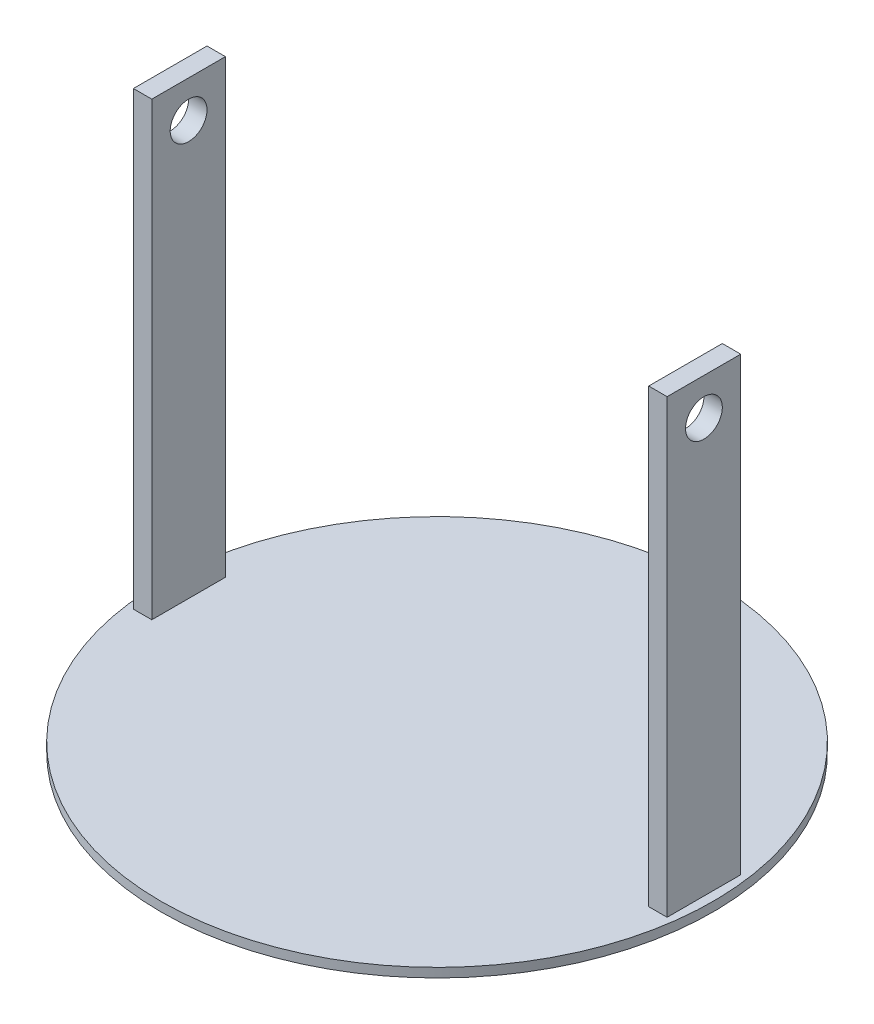
ISO-10303-21;
HEADER;
FILE_DESCRIPTION(('STEP AP214'),'2;1');
FILE_NAME('part.step','',(''),(''),'','','');
FILE_SCHEMA(('AUTOMOTIVE_DESIGN { 1 0 10303 214 1 1 1 1 }'));
ENDSEC;
DATA;
#1=APPLICATION_CONTEXT('core data for automotive mechanical design processes');
#2=APPLICATION_PROTOCOL_DEFINITION('international standard','automotive_design',2000,#1);
#3=PRODUCT_CONTEXT('',#1,'mechanical');
#4=PRODUCT('Part','Part','',(#3));
#5=PRODUCT_RELATED_PRODUCT_CATEGORY('part','',(#4));
#6=PRODUCT_DEFINITION_FORMATION('','',#4);
#7=PRODUCT_DEFINITION_CONTEXT('part definition',#1,'design');
#8=PRODUCT_DEFINITION('design','',#6,#7);
#9=PRODUCT_DEFINITION_SHAPE('','',#8);
#10=(LENGTH_UNIT() NAMED_UNIT(*) SI_UNIT(.MILLI.,.METRE.));
#11=(NAMED_UNIT(*) PLANE_ANGLE_UNIT() SI_UNIT($,.RADIAN.));
#12=(NAMED_UNIT(*) SI_UNIT($,.STERADIAN.) SOLID_ANGLE_UNIT());
#13=UNCERTAINTY_MEASURE_WITH_UNIT(LENGTH_MEASURE(1.E-05),#10,'distance_accuracy_value','');
#14=(GEOMETRIC_REPRESENTATION_CONTEXT(3) GLOBAL_UNCERTAINTY_ASSIGNED_CONTEXT((#13)) GLOBAL_UNIT_ASSIGNED_CONTEXT((#10,
#11,#12)) REPRESENTATION_CONTEXT('',''));
#15=CARTESIAN_POINT('',(0.,0.,0.));
#16=DIRECTION('',(0.,0.,1.));
#17=DIRECTION('',(1.,0.,0.));
#18=AXIS2_PLACEMENT_3D('',#15,#16,#17);
#19=CARTESIAN_POINT('',(-145.,250.,-19.9999999999999));
#20=DIRECTION('',(0.,0.,-1.));
#21=DIRECTION('',(-1.,0.,0.));
#22=AXIS2_PLACEMENT_3D('',#19,#20,#21);
#23=PLANE('',#22);
#24=DIRECTION('',(1.,0.,0.));
#25=VECTOR('',#24,1.);
#26=CARTESIAN_POINT('',(0.,5.,-19.9999999999999));
#27=LINE('',#26,#25);
#28=CARTESIAN_POINT('',(-145.,5.,-19.9999999999999));
#29=VERTEX_POINT('',#28);
#30=CARTESIAN_POINT('',(-135.,5.,-19.9999999999999));
#31=VERTEX_POINT('',#30);
#32=EDGE_CURVE('E62',#29,#31,#27,.T.);
#33=ORIENTED_EDGE('',*,*,#32,.F.);
#34=DIRECTION('',(0.,-1.,0.));
#35=VECTOR('',#34,1.);
#36=CARTESIAN_POINT('',(-145.,250.,-19.9999999999999));
#37=LINE('',#36,#35);
#38=CARTESIAN_POINT('',(-145.,250.,-19.9999999999999));
#39=VERTEX_POINT('',#38);
#40=EDGE_CURVE('E11',#39,#29,#37,.T.);
#41=ORIENTED_EDGE('',*,*,#40,.F.);
#42=DIRECTION('',(1.,0.,0.));
#43=VECTOR('',#42,1.);
#44=CARTESIAN_POINT('',(-145.,250.,-19.9999999999999));
#45=LINE('',#44,#43);
#46=CARTESIAN_POINT('',(-135.,250.,-19.9999999999999));
#47=VERTEX_POINT('',#46);
#48=EDGE_CURVE('E176',#39,#47,#45,.T.);
#49=ORIENTED_EDGE('',*,*,#48,.T.);
#50=DIRECTION('',(0.,-1.,0.));
#51=VECTOR('',#50,1.);
#52=CARTESIAN_POINT('',(-135.,250.,-19.9999999999999));
#53=LINE('',#52,#51);
#54=EDGE_CURVE('E48',#47,#31,#53,.T.);
#55=ORIENTED_EDGE('',*,*,#54,.T.);
#56=EDGE_LOOP('',(#33,#41,#49,#55));
#57=FACE_BOUND('',#56,.T.);
#58=ADVANCED_FACE('F45',(#57),#23,.T.);
#59=CARTESIAN_POINT('',(-145.,250.,-19.9999999999999));
#60=DIRECTION('',(1.,0.,0.));
#61=DIRECTION('',(0.,0.,-1.));
#62=AXIS2_PLACEMENT_3D('',#59,#60,#61);
#63=PLANE('',#62);
#64=CARTESIAN_POINT('',(-145.,230.,0.));
#65=DIRECTION('',(1.,0.,0.));
#66=DIRECTION('',(0.,0.,-1.));
#67=AXIS2_PLACEMENT_3D('',#64,#65,#66);
#68=CIRCLE('',#67,10.);
#69=CARTESIAN_POINT('',(-145.,230.,-10.));
#70=VERTEX_POINT('',#69);
#71=EDGE_CURVE('E269',#70,#70,#68,.T.);
#72=ORIENTED_EDGE('',*,*,#71,.T.);
#73=EDGE_LOOP('',(#72));
#74=FACE_BOUND('',#73,.T.);
#75=ORIENTED_EDGE('',*,*,#40,.T.);
#76=DIRECTION('',(0.,0.,1.));
#77=VECTOR('',#76,1.);
#78=CARTESIAN_POINT('',(-145.,5.,0.));
#79=LINE('',#78,#77);
#80=CARTESIAN_POINT('',(-145.,5.,20.0000000000001));
#81=VERTEX_POINT('',#80);
#82=EDGE_CURVE('E68',#29,#81,#79,.T.);
#83=ORIENTED_EDGE('',*,*,#82,.T.);
#84=DIRECTION('',(0.,-1.,0.));
#85=VECTOR('',#84,1.);
#86=CARTESIAN_POINT('',(-145.,250.,20.0000000000001));
#87=LINE('',#86,#85);
#88=CARTESIAN_POINT('',(-145.,250.,20.0000000000001));
#89=VERTEX_POINT('',#88);
#90=EDGE_CURVE('E54',#89,#81,#87,.T.);
#91=ORIENTED_EDGE('',*,*,#90,.F.);
#92=DIRECTION('',(0.,0.,1.));
#93=VECTOR('',#92,1.);
#94=CARTESIAN_POINT('',(-145.,250.,-19.9999999999999));
#95=LINE('',#94,#93);
#96=EDGE_CURVE('E190',#39,#89,#95,.T.);
#97=ORIENTED_EDGE('',*,*,#96,.F.);
#98=EDGE_LOOP('',(#75,#83,#91,#97));
#99=FACE_BOUND('',#98,.T.);
#100=ADVANCED_FACE('F209',(#74,#99),#63,.F.);
#101=CARTESIAN_POINT('',(-145.,250.,20.0000000000001));
#102=DIRECTION('',(0.,0.,-1.));
#103=DIRECTION('',(-1.,0.,0.));
#104=AXIS2_PLACEMENT_3D('',#101,#102,#103);
#105=PLANE('',#104);
#106=ORIENTED_EDGE('',*,*,#90,.T.);
#107=DIRECTION('',(1.,0.,0.));
#108=VECTOR('',#107,1.);
#109=CARTESIAN_POINT('',(0.,5.,20.0000000000001));
#110=LINE('',#109,#108);
#111=CARTESIAN_POINT('',(-135.,5.,20.0000000000001));
#112=VERTEX_POINT('',#111);
#113=EDGE_CURVE('E152',#81,#112,#110,.T.);
#114=ORIENTED_EDGE('',*,*,#113,.T.);
#115=DIRECTION('',(0.,-1.,0.));
#116=VECTOR('',#115,1.);
#117=CARTESIAN_POINT('',(-135.,250.,20.0000000000001));
#118=LINE('',#117,#116);
#119=CARTESIAN_POINT('',(-135.,250.,20.0000000000001));
#120=VERTEX_POINT('',#119);
#121=EDGE_CURVE('E194',#120,#112,#118,.T.);
#122=ORIENTED_EDGE('',*,*,#121,.F.);
#123=DIRECTION('',(1.,0.,0.));
#124=VECTOR('',#123,1.);
#125=CARTESIAN_POINT('',(-145.,250.,20.0000000000001));
#126=LINE('',#125,#124);
#127=EDGE_CURVE('E187',#89,#120,#126,.T.);
#128=ORIENTED_EDGE('',*,*,#127,.F.);
#129=EDGE_LOOP('',(#106,#114,#122,#128));
#130=FACE_BOUND('',#129,.T.);
#131=ADVANCED_FACE('F206',(#130),#105,.F.);
#132=CARTESIAN_POINT('',(-135.,250.,-19.9999999999999));
#133=DIRECTION('',(1.,0.,0.));
#134=DIRECTION('',(0.,0.,-1.));
#135=AXIS2_PLACEMENT_3D('',#132,#133,#134);
#136=PLANE('',#135);
#137=CARTESIAN_POINT('',(-135.,230.,0.));
#138=DIRECTION('',(1.,0.,0.));
#139=DIRECTION('',(0.,0.,-1.));
#140=AXIS2_PLACEMENT_3D('',#137,#138,#139);
#141=CIRCLE('',#140,10.);
#142=CARTESIAN_POINT('',(-135.,230.,-10.));
#143=VERTEX_POINT('',#142);
#144=EDGE_CURVE('E267',#143,#143,#141,.T.);
#145=ORIENTED_EDGE('',*,*,#144,.F.);
#146=EDGE_LOOP('',(#145));
#147=FACE_BOUND('',#146,.T.);
#148=DIRECTION('',(0.,0.,1.));
#149=VECTOR('',#148,1.);
#150=CARTESIAN_POINT('',(-135.,5.,0.));
#151=LINE('',#150,#149);
#152=EDGE_CURVE('E148',#31,#112,#151,.T.);
#153=ORIENTED_EDGE('',*,*,#152,.F.);
#154=ORIENTED_EDGE('',*,*,#54,.F.);
#155=DIRECTION('',(0.,0.,1.));
#156=VECTOR('',#155,1.);
#157=CARTESIAN_POINT('',(-135.,250.,-19.9999999999999));
#158=LINE('',#157,#156);
#159=EDGE_CURVE('E183',#47,#120,#158,.T.);
#160=ORIENTED_EDGE('',*,*,#159,.T.);
#161=ORIENTED_EDGE('',*,*,#121,.T.);
#162=EDGE_LOOP('',(#153,#154,#160,#161));
#163=FACE_BOUND('',#162,.T.);
#164=ADVANCED_FACE('F212',(#147,#163),#136,.T.);
#165=CARTESIAN_POINT('',(0.,250.,0.));
#166=DIRECTION('',(0.,-1.,0.));
#167=DIRECTION('',(0.,0.,-1.));
#168=AXIS2_PLACEMENT_3D('',#165,#166,#167);
#169=PLANE('',#168);
#170=ORIENTED_EDGE('',*,*,#48,.F.);
#171=ORIENTED_EDGE('',*,*,#96,.T.);
#172=ORIENTED_EDGE('',*,*,#127,.T.);
#173=ORIENTED_EDGE('',*,*,#159,.F.);
#174=EDGE_LOOP('',(#170,#171,#172,#173));
#175=FACE_BOUND('',#174,.T.);
#176=ADVANCED_FACE('F211',(#175),#169,.F.);
#177=CARTESIAN_POINT('',(0.,5.,0.));
#178=DIRECTION('',(0.,-1.,0.));
#179=DIRECTION('',(0.,0.,-1.));
#180=AXIS2_PLACEMENT_3D('',#177,#178,#179);
#181=CYLINDRICAL_SURFACE('',#180,150.);
#182=CARTESIAN_POINT('',(0.,5.,0.));
#183=DIRECTION('',(0.,1.,0.));
#184=DIRECTION('',(0.,0.,1.));
#185=AXIS2_PLACEMENT_3D('',#182,#183,#184);
#186=CIRCLE('',#185,150.);
#187=CARTESIAN_POINT('',(0.,5.,150.));
#188=VERTEX_POINT('',#187);
#189=EDGE_CURVE('E172',#188,#188,#186,.T.);
#190=ORIENTED_EDGE('',*,*,#189,.F.);
#191=EDGE_LOOP('',(#190));
#192=FACE_BOUND('',#191,.T.);
#193=CARTESIAN_POINT('',(0.,0.,0.));
#194=DIRECTION('',(0.,1.,0.));
#195=DIRECTION('',(0.,0.,1.));
#196=AXIS2_PLACEMENT_3D('',#193,#194,#195);
#197=CIRCLE('',#196,150.);
#198=CARTESIAN_POINT('',(0.,0.,150.));
#199=VERTEX_POINT('',#198);
#200=EDGE_CURVE('E133',#199,#199,#197,.T.);
#201=ORIENTED_EDGE('',*,*,#200,.T.);
#202=EDGE_LOOP('',(#201));
#203=FACE_BOUND('',#202,.T.);
#204=ADVANCED_FACE('F220',(#192,#203),#181,.T.);
#205=CARTESIAN_POINT('',(0.,5.,0.));
#206=DIRECTION('',(0.,1.,0.));
#207=DIRECTION('',(0.,0.,1.));
#208=AXIS2_PLACEMENT_3D('',#205,#206,#207);
#209=PLANE('',#208);
#210=ORIENTED_EDGE('',*,*,#152,.T.);
#211=ORIENTED_EDGE('',*,*,#113,.F.);
#212=ORIENTED_EDGE('',*,*,#82,.F.);
#213=ORIENTED_EDGE('',*,*,#32,.T.);
#214=EDGE_LOOP('',(#210,#211,#212,#213));
#215=FACE_BOUND('',#214,.T.);
#216=DIRECTION('',(-1.,0.,0.));
#217=VECTOR('',#216,1.);
#218=CARTESIAN_POINT('',(0.,5.,20.));
#219=LINE('',#218,#217);
#220=CARTESIAN_POINT('',(145.,5.,20.));
#221=VERTEX_POINT('',#220);
#222=CARTESIAN_POINT('',(135.,5.,20.));
#223=VERTEX_POINT('',#222);
#224=EDGE_CURVE('E160',#221,#223,#219,.T.);
#225=ORIENTED_EDGE('',*,*,#224,.T.);
#226=DIRECTION('',(0.,0.,1.));
#227=VECTOR('',#226,1.);
#228=CARTESIAN_POINT('',(135.,5.,0.));
#229=LINE('',#228,#227);
#230=CARTESIAN_POINT('',(135.,5.,-20.));
#231=VERTEX_POINT('',#230);
#232=EDGE_CURVE('E164',#231,#223,#229,.T.);
#233=ORIENTED_EDGE('',*,*,#232,.F.);
#234=DIRECTION('',(-1.,0.,0.));
#235=VECTOR('',#234,1.);
#236=CARTESIAN_POINT('',(0.,5.,-20.));
#237=LINE('',#236,#235);
#238=CARTESIAN_POINT('',(145.,5.,-20.));
#239=VERTEX_POINT('',#238);
#240=EDGE_CURVE('E167',#239,#231,#237,.T.);
#241=ORIENTED_EDGE('',*,*,#240,.F.);
#242=DIRECTION('',(0.,0.,1.));
#243=VECTOR('',#242,1.);
#244=CARTESIAN_POINT('',(145.,5.,0.));
#245=LINE('',#244,#243);
#246=EDGE_CURVE('E119',#239,#221,#245,.T.);
#247=ORIENTED_EDGE('',*,*,#246,.T.);
#248=EDGE_LOOP('',(#225,#233,#241,#247));
#249=FACE_BOUND('',#248,.T.);
#250=ORIENTED_EDGE('',*,*,#189,.T.);
#251=EDGE_LOOP('',(#250));
#252=FACE_BOUND('',#251,.T.);
#253=ADVANCED_FACE('F202',(#215,#249,#252),#209,.T.);
#254=CARTESIAN_POINT('',(0.,0.,0.));
#255=DIRECTION('',(0.,-1.,0.));
#256=DIRECTION('',(0.,0.,-1.));
#257=AXIS2_PLACEMENT_3D('',#254,#255,#256);
#258=PLANE('',#257);
#259=ORIENTED_EDGE('',*,*,#200,.F.);
#260=EDGE_LOOP('',(#259));
#261=FACE_BOUND('',#260,.T.);
#262=ADVANCED_FACE('F235',(#261),#258,.T.);
#263=CARTESIAN_POINT('',(145.,250.,-20.));
#264=DIRECTION('',(0.,0.,1.));
#265=DIRECTION('',(1.,0.,0.));
#266=AXIS2_PLACEMENT_3D('',#263,#264,#265);
#267=PLANE('',#266);
#268=ORIENTED_EDGE('',*,*,#240,.T.);
#269=DIRECTION('',(0.,-1.,0.));
#270=VECTOR('',#269,1.);
#271=CARTESIAN_POINT('',(135.,250.,-20.));
#272=LINE('',#271,#270);
#273=CARTESIAN_POINT('',(135.,250.,-20.));
#274=VERTEX_POINT('',#273);
#275=EDGE_CURVE('E130',#274,#231,#272,.T.);
#276=ORIENTED_EDGE('',*,*,#275,.F.);
#277=DIRECTION('',(-1.,0.,0.));
#278=VECTOR('',#277,1.);
#279=CARTESIAN_POINT('',(145.,250.,-20.));
#280=LINE('',#279,#278);
#281=CARTESIAN_POINT('',(145.,250.,-20.));
#282=VERTEX_POINT('',#281);
#283=EDGE_CURVE('E127',#282,#274,#280,.T.);
#284=ORIENTED_EDGE('',*,*,#283,.F.);
#285=DIRECTION('',(0.,-1.,0.));
#286=VECTOR('',#285,1.);
#287=CARTESIAN_POINT('',(145.,250.,-20.));
#288=LINE('',#287,#286);
#289=EDGE_CURVE('E113',#282,#239,#288,.T.);
#290=ORIENTED_EDGE('',*,*,#289,.T.);
#291=EDGE_LOOP('',(#268,#276,#284,#290));
#292=FACE_BOUND('',#291,.T.);
#293=ADVANCED_FACE('F128',(#292),#267,.F.);
#294=CARTESIAN_POINT('',(135.,250.,-20.));
#295=DIRECTION('',(1.,0.,0.));
#296=DIRECTION('',(0.,0.,-1.));
#297=AXIS2_PLACEMENT_3D('',#294,#295,#296);
#298=PLANE('',#297);
#299=CARTESIAN_POINT('',(135.,230.,0.));
#300=DIRECTION('',(1.,0.,0.));
#301=DIRECTION('',(0.,0.,-1.));
#302=AXIS2_PLACEMENT_3D('',#299,#300,#301);
#303=CIRCLE('',#302,10.);
#304=CARTESIAN_POINT('',(135.,230.,-10.));
#305=VERTEX_POINT('',#304);
#306=EDGE_CURVE('E271',#305,#305,#303,.T.);
#307=ORIENTED_EDGE('',*,*,#306,.T.);
#308=EDGE_LOOP('',(#307));
#309=FACE_BOUND('',#308,.T.);
#310=ORIENTED_EDGE('',*,*,#232,.T.);
#311=DIRECTION('',(0.,-1.,0.));
#312=VECTOR('',#311,1.);
#313=CARTESIAN_POINT('',(135.,250.,20.));
#314=LINE('',#313,#312);
#315=CARTESIAN_POINT('',(135.,250.,20.));
#316=VERTEX_POINT('',#315);
#317=EDGE_CURVE('E285',#316,#223,#314,.T.);
#318=ORIENTED_EDGE('',*,*,#317,.F.);
#319=DIRECTION('',(0.,0.,1.));
#320=VECTOR('',#319,1.);
#321=CARTESIAN_POINT('',(135.,250.,-20.));
#322=LINE('',#321,#320);
#323=EDGE_CURVE('E134',#274,#316,#322,.T.);
#324=ORIENTED_EDGE('',*,*,#323,.F.);
#325=ORIENTED_EDGE('',*,*,#275,.T.);
#326=EDGE_LOOP('',(#310,#318,#324,#325));
#327=FACE_BOUND('',#326,.T.);
#328=ADVANCED_FACE('F252',(#309,#327),#298,.F.);
#329=CARTESIAN_POINT('',(145.,250.,20.));
#330=DIRECTION('',(0.,0.,1.));
#331=DIRECTION('',(1.,0.,0.));
#332=AXIS2_PLACEMENT_3D('',#329,#330,#331);
#333=PLANE('',#332);
#334=ORIENTED_EDGE('',*,*,#317,.T.);
#335=ORIENTED_EDGE('',*,*,#224,.F.);
#336=DIRECTION('',(0.,-1.,0.));
#337=VECTOR('',#336,1.);
#338=CARTESIAN_POINT('',(145.,250.,20.));
#339=LINE('',#338,#337);
#340=CARTESIAN_POINT('',(145.,250.,20.));
#341=VERTEX_POINT('',#340);
#342=EDGE_CURVE('E123',#341,#221,#339,.T.);
#343=ORIENTED_EDGE('',*,*,#342,.F.);
#344=DIRECTION('',(-1.,0.,0.));
#345=VECTOR('',#344,1.);
#346=CARTESIAN_POINT('',(145.,250.,20.));
#347=LINE('',#346,#345);
#348=EDGE_CURVE('E139',#341,#316,#347,.T.);
#349=ORIENTED_EDGE('',*,*,#348,.T.);
#350=EDGE_LOOP('',(#334,#335,#343,#349));
#351=FACE_BOUND('',#350,.T.);
#352=ADVANCED_FACE('F248',(#351),#333,.T.);
#353=CARTESIAN_POINT('',(145.,250.,-20.));
#354=DIRECTION('',(1.,0.,0.));
#355=DIRECTION('',(0.,0.,-1.));
#356=AXIS2_PLACEMENT_3D('',#353,#354,#355);
#357=PLANE('',#356);
#358=CARTESIAN_POINT('',(145.,230.,0.));
#359=DIRECTION('',(1.,0.,0.));
#360=DIRECTION('',(0.,0.,-1.));
#361=AXIS2_PLACEMENT_3D('',#358,#359,#360);
#362=CIRCLE('',#361,10.);
#363=CARTESIAN_POINT('',(145.,230.,-10.));
#364=VERTEX_POINT('',#363);
#365=EDGE_CURVE('E272',#364,#364,#362,.T.);
#366=ORIENTED_EDGE('',*,*,#365,.F.);
#367=EDGE_LOOP('',(#366));
#368=FACE_BOUND('',#367,.T.);
#369=ORIENTED_EDGE('',*,*,#342,.T.);
#370=ORIENTED_EDGE('',*,*,#246,.F.);
#371=ORIENTED_EDGE('',*,*,#289,.F.);
#372=DIRECTION('',(0.,0.,1.));
#373=VECTOR('',#372,1.);
#374=CARTESIAN_POINT('',(145.,250.,-20.));
#375=LINE('',#374,#373);
#376=EDGE_CURVE('E117',#282,#341,#375,.T.);
#377=ORIENTED_EDGE('',*,*,#376,.T.);
#378=EDGE_LOOP('',(#369,#370,#371,#377));
#379=FACE_BOUND('',#378,.T.);
#380=ADVANCED_FACE('F115',(#368,#379),#357,.T.);
#381=CARTESIAN_POINT('',(0.,250.,0.));
#382=DIRECTION('',(0.,1.,0.));
#383=DIRECTION('',(0.,0.,1.));
#384=AXIS2_PLACEMENT_3D('',#381,#382,#383);
#385=PLANE('',#384);
#386=ORIENTED_EDGE('',*,*,#283,.T.);
#387=ORIENTED_EDGE('',*,*,#323,.T.);
#388=ORIENTED_EDGE('',*,*,#348,.F.);
#389=ORIENTED_EDGE('',*,*,#376,.F.);
#390=EDGE_LOOP('',(#386,#387,#388,#389));
#391=FACE_BOUND('',#390,.T.);
#392=ADVANCED_FACE('F137',(#391),#385,.T.);
#393=CARTESIAN_POINT('',(-145.,230.,0.));
#394=DIRECTION('',(1.,0.,0.));
#395=DIRECTION('',(0.,0.,-1.));
#396=AXIS2_PLACEMENT_3D('',#393,#394,#395);
#397=CYLINDRICAL_SURFACE('',#396,10.);
#398=ORIENTED_EDGE('',*,*,#365,.T.);
#399=EDGE_LOOP('',(#398));
#400=FACE_BOUND('',#399,.T.);
#401=ORIENTED_EDGE('',*,*,#306,.F.);
#402=EDGE_LOOP('',(#401));
#403=FACE_BOUND('',#402,.T.);
#404=ADVANCED_FACE('F245',(#400,#403),#397,.F.);
#405=ORIENTED_EDGE('',*,*,#144,.T.);
#406=EDGE_LOOP('',(#405));
#407=FACE_BOUND('',#406,.T.);
#408=ORIENTED_EDGE('',*,*,#71,.F.);
#409=EDGE_LOOP('',(#408));
#410=FACE_BOUND('',#409,.T.);
#411=ADVANCED_FACE('F258',(#407,#410),#397,.F.);
#412=CLOSED_SHELL('',(#58,#100,#131,#164,#176,#204,#253,#262,#293,#328,#352,#380,#392,#404,#411));
#413=MANIFOLD_SOLID_BREP('B2',#412);
#414=ADVANCED_BREP_SHAPE_REPRESENTATION('',(#18,#413),#14);
#415=SHAPE_DEFINITION_REPRESENTATION(#9,#414);
ENDSEC;
END-ISO-10303-21;
